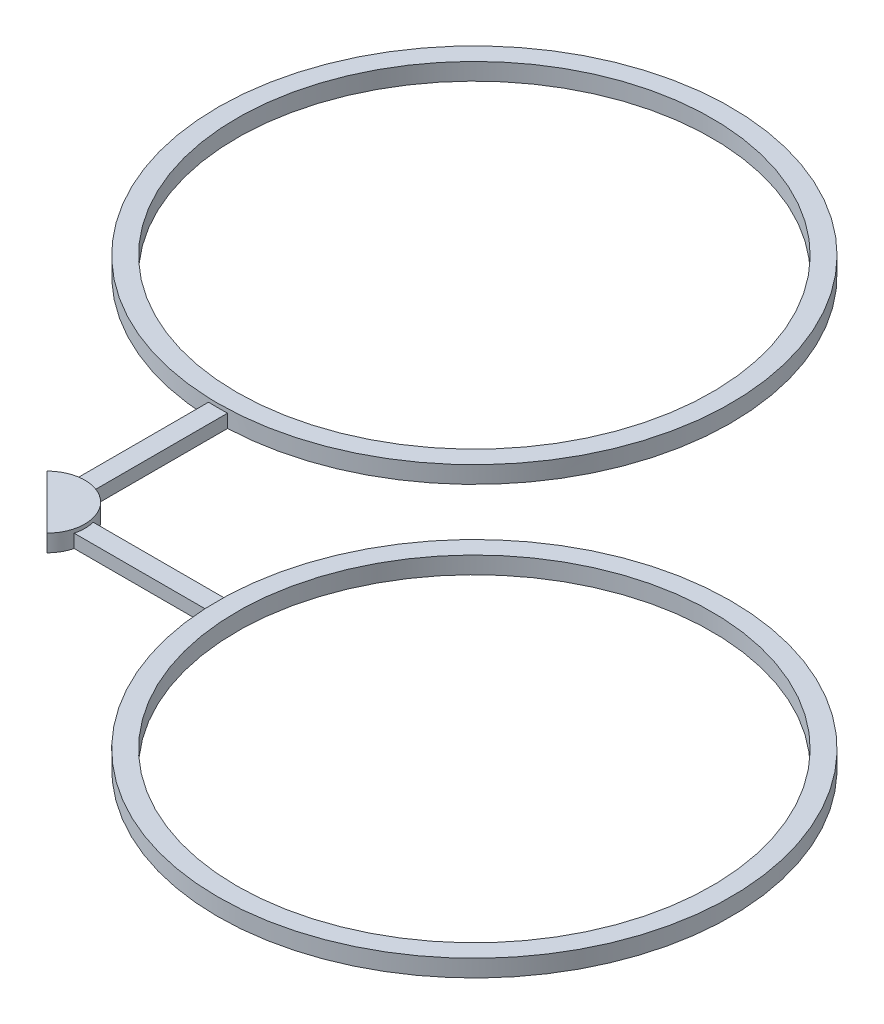
ISO-10303-21;
HEADER;
FILE_DESCRIPTION(('STEP AP214'),'2;1');
FILE_NAME('part.step','',(''),(''),'','','');
FILE_SCHEMA(('AUTOMOTIVE_DESIGN { 1 0 10303 214 1 1 1 1 }'));
ENDSEC;
DATA;
#1=APPLICATION_CONTEXT('core data for automotive mechanical design processes');
#2=APPLICATION_PROTOCOL_DEFINITION('international standard','automotive_design',2000,#1);
#3=PRODUCT_CONTEXT('',#1,'mechanical');
#4=PRODUCT('Part','Part','',(#3));
#5=PRODUCT_RELATED_PRODUCT_CATEGORY('part','',(#4));
#6=PRODUCT_DEFINITION_FORMATION('','',#4);
#7=PRODUCT_DEFINITION_CONTEXT('part definition',#1,'design');
#8=PRODUCT_DEFINITION('design','',#6,#7);
#9=PRODUCT_DEFINITION_SHAPE('','',#8);
#10=(LENGTH_UNIT() NAMED_UNIT(*) SI_UNIT(.MILLI.,.METRE.));
#11=(NAMED_UNIT(*) PLANE_ANGLE_UNIT() SI_UNIT($,.RADIAN.));
#12=(NAMED_UNIT(*) SI_UNIT($,.STERADIAN.) SOLID_ANGLE_UNIT());
#13=UNCERTAINTY_MEASURE_WITH_UNIT(LENGTH_MEASURE(1.E-05),#10,'distance_accuracy_value','');
#14=(GEOMETRIC_REPRESENTATION_CONTEXT(3) GLOBAL_UNCERTAINTY_ASSIGNED_CONTEXT((#13)) GLOBAL_UNIT_ASSIGNED_CONTEXT((#10,
#11,#12)) REPRESENTATION_CONTEXT('',''));
#15=CARTESIAN_POINT('',(0.,0.,0.));
#16=DIRECTION('',(0.,0.,1.));
#17=DIRECTION('',(1.,0.,0.));
#18=AXIS2_PLACEMENT_3D('',#15,#16,#17);
#19=CARTESIAN_POINT('',(0.,1.8,0.));
#20=DIRECTION('',(0.,-1.,0.));
#21=DIRECTION('',(0.,0.,-1.));
#22=AXIS2_PLACEMENT_3D('',#19,#20,#21);
#23=CYLINDRICAL_SURFACE('',#22,4.);
#24=CARTESIAN_POINT('',(0.,1.4,0.));
#25=DIRECTION('',(0.,1.,0.));
#26=DIRECTION('',(0.,0.,1.));
#27=AXIS2_PLACEMENT_3D('',#24,#25,#26);
#28=CIRCLE('',#27,4.);
#29=CARTESIAN_POINT('',(3.87298334620742,1.4,0.999999999999988));
#30=VERTEX_POINT('',#29);
#31=CARTESIAN_POINT('',(3.87298334620741,1.4,-1.00000000000001));
#32=VERTEX_POINT('',#31);
#33=EDGE_CURVE('E128',#30,#32,#28,.T.);
#34=ORIENTED_EDGE('',*,*,#33,.T.);
#35=DIRECTION('',(0.,-1.,0.));
#36=VECTOR('',#35,1.);
#37=CARTESIAN_POINT('',(3.87298334620741,1.4,-1.00000000000001));
#38=LINE('',#37,#36);
#39=CARTESIAN_POINT('',(3.87298334620741,0.,-1.00000000000001));
#40=VERTEX_POINT('',#39);
#41=EDGE_CURVE('E162',#32,#40,#38,.T.);
#42=ORIENTED_EDGE('',*,*,#41,.T.);
#43=CARTESIAN_POINT('',(0.,0.,0.));
#44=DIRECTION('',(0.,1.,0.));
#45=DIRECTION('',(0.,0.,1.));
#46=AXIS2_PLACEMENT_3D('',#43,#44,#45);
#47=CIRCLE('',#46,4.);
#48=CARTESIAN_POINT('',(0.999999999999999,0.,-3.87298334620742));
#49=VERTEX_POINT('',#48);
#50=EDGE_CURVE('E230',#49,#40,#47,.F.);
#51=ORIENTED_EDGE('',*,*,#50,.F.);
#52=DIRECTION('',(0.,-1.,0.));
#53=VECTOR('',#52,1.);
#54=CARTESIAN_POINT('',(0.999999999999999,1.4,-3.87298334620742));
#55=LINE('',#54,#53);
#56=CARTESIAN_POINT('',(0.999999999999999,1.4,-3.87298334620742));
#57=VERTEX_POINT('',#56);
#58=EDGE_CURVE('E210',#57,#49,#55,.T.);
#59=ORIENTED_EDGE('',*,*,#58,.F.);
#60=CARTESIAN_POINT('',(0.,1.4,0.));
#61=DIRECTION('',(0.,1.,0.));
#62=DIRECTION('',(0.,0.,1.));
#63=AXIS2_PLACEMENT_3D('',#60,#61,#62);
#64=CIRCLE('',#63,4.);
#65=CARTESIAN_POINT('',(-1.,1.4,-3.87298334620742));
#66=VERTEX_POINT('',#65);
#67=EDGE_CURVE('E188',#66,#57,#64,.F.);
#68=ORIENTED_EDGE('',*,*,#67,.F.);
#69=DIRECTION('',(0.,-1.,0.));
#70=VECTOR('',#69,1.);
#71=CARTESIAN_POINT('',(-1.,1.4,-3.87298334620742));
#72=LINE('',#71,#70);
#73=CARTESIAN_POINT('',(-1.,0.,-3.87298334620742));
#74=VERTEX_POINT('',#73);
#75=EDGE_CURVE('E213',#66,#74,#72,.T.);
#76=ORIENTED_EDGE('',*,*,#75,.T.);
#77=CARTESIAN_POINT('',(-2.8284271247462,0.,-2.82842712474619));
#78=VERTEX_POINT('',#77);
#79=EDGE_CURVE('E226',#78,#74,#47,.F.);
#80=ORIENTED_EDGE('',*,*,#79,.F.);
#81=DIRECTION('',(0.,-1.,0.));
#82=VECTOR('',#81,1.);
#83=CARTESIAN_POINT('',(-2.8284271247462,1.8,-2.82842712474619));
#84=LINE('',#83,#82);
#85=CARTESIAN_POINT('',(-2.8284271247462,1.8,-2.82842712474619));
#86=VERTEX_POINT('',#85);
#87=EDGE_CURVE('E12',#86,#78,#84,.T.);
#88=ORIENTED_EDGE('',*,*,#87,.F.);
#89=CARTESIAN_POINT('',(0.,1.8,0.));
#90=DIRECTION('',(0.,1.,0.));
#91=DIRECTION('',(0.,0.,1.));
#92=AXIS2_PLACEMENT_3D('',#89,#90,#91);
#93=CIRCLE('',#92,4.);
#94=CARTESIAN_POINT('',(2.8284271247462,1.8,2.82842712474619));
#95=VERTEX_POINT('',#94);
#96=EDGE_CURVE('E218',#86,#95,#93,.F.);
#97=ORIENTED_EDGE('',*,*,#96,.T.);
#98=DIRECTION('',(0.,-1.,0.));
#99=VECTOR('',#98,1.);
#100=CARTESIAN_POINT('',(2.8284271247462,1.8,2.82842712474619));
#101=LINE('',#100,#99);
#102=CARTESIAN_POINT('',(2.8284271247462,0.,2.82842712474619));
#103=VERTEX_POINT('',#102);
#104=EDGE_CURVE('E53',#95,#103,#101,.T.);
#105=ORIENTED_EDGE('',*,*,#104,.T.);
#106=CARTESIAN_POINT('',(3.87298334620742,0.,0.999999999999988));
#107=VERTEX_POINT('',#106);
#108=EDGE_CURVE('E217',#107,#103,#47,.F.);
#109=ORIENTED_EDGE('',*,*,#108,.F.);
#110=DIRECTION('',(0.,-1.,0.));
#111=VECTOR('',#110,1.);
#112=CARTESIAN_POINT('',(3.87298334620742,1.4,0.999999999999988));
#113=LINE('',#112,#111);
#114=EDGE_CURVE('E139',#30,#107,#113,.T.);
#115=ORIENTED_EDGE('',*,*,#114,.F.);
#116=EDGE_LOOP('',(#34,#42,#51,#59,#68,#76,#80,#88,#97,#105,#109,#115));
#117=FACE_BOUND('',#116,.T.);
#118=ADVANCED_FACE('F45',(#117),#23,.T.);
#119=CARTESIAN_POINT('',(0.,1.8,0.));
#120=DIRECTION('',(0.707106781186546,0.,-0.707106781186549));
#121=DIRECTION('',(-0.707106781186549,0.,-0.707106781186546));
#122=AXIS2_PLACEMENT_3D('',#119,#120,#121);
#123=PLANE('',#122);
#124=DIRECTION('',(0.707106781186549,0.,0.707106781186546));
#125=VECTOR('',#124,1.);
#126=CARTESIAN_POINT('',(0.,0.,0.));
#127=LINE('',#126,#125);
#128=EDGE_CURVE('E223',#78,#103,#127,.T.);
#129=ORIENTED_EDGE('',*,*,#128,.T.);
#130=ORIENTED_EDGE('',*,*,#104,.F.);
#131=DIRECTION('',(0.707106781186549,0.,0.707106781186546));
#132=VECTOR('',#131,1.);
#133=CARTESIAN_POINT('',(0.,1.8,0.));
#134=LINE('',#133,#132);
#135=EDGE_CURVE('E222',#86,#95,#134,.T.);
#136=ORIENTED_EDGE('',*,*,#135,.F.);
#137=ORIENTED_EDGE('',*,*,#87,.T.);
#138=EDGE_LOOP('',(#129,#130,#136,#137));
#139=FACE_BOUND('',#138,.T.);
#140=ADVANCED_FACE('F242',(#139),#123,.F.);
#141=CARTESIAN_POINT('',(0.,1.8,0.));
#142=DIRECTION('',(0.,1.,0.));
#143=DIRECTION('',(0.,0.,1.));
#144=AXIS2_PLACEMENT_3D('',#141,#142,#143);
#145=PLANE('',#144);
#146=ORIENTED_EDGE('',*,*,#96,.F.);
#147=ORIENTED_EDGE('',*,*,#135,.T.);
#148=EDGE_LOOP('',(#146,#147));
#149=FACE_BOUND('',#148,.T.);
#150=ADVANCED_FACE('F296',(#149),#145,.T.);
#151=CARTESIAN_POINT('',(0.,0.,0.));
#152=DIRECTION('',(0.,1.,0.));
#153=DIRECTION('',(0.,0.,1.));
#154=AXIS2_PLACEMENT_3D('',#151,#152,#153);
#155=PLANE('',#154);
#156=ORIENTED_EDGE('',*,*,#79,.T.);
#157=DIRECTION('',(0.,0.,1.));
#158=VECTOR('',#157,1.);
#159=CARTESIAN_POINT('',(-1.,0.,0.));
#160=LINE('',#159,#158);
#161=CARTESIAN_POINT('',(-1.,0.,-18.0185248735359));
#162=VERTEX_POINT('',#161);
#163=EDGE_CURVE('E178',#162,#74,#160,.T.);
#164=ORIENTED_EDGE('',*,*,#163,.F.);
#165=CARTESIAN_POINT('',(0.,0.,-45.));
#166=DIRECTION('',(0.,1.,0.));
#167=DIRECTION('',(0.,0.,1.));
#168=AXIS2_PLACEMENT_3D('',#165,#166,#167);
#169=CIRCLE('',#168,27.);
#170=CARTESIAN_POINT('',(0.999999999999996,0.,-18.0185248735359));
#171=VERTEX_POINT('',#170);
#172=EDGE_CURVE('E174',#171,#162,#169,.T.);
#173=ORIENTED_EDGE('',*,*,#172,.F.);
#174=DIRECTION('',(0.,0.,1.));
#175=VECTOR('',#174,1.);
#176=CARTESIAN_POINT('',(1.,0.,0.));
#177=LINE('',#176,#175);
#178=EDGE_CURVE('E67',#171,#49,#177,.T.);
#179=ORIENTED_EDGE('',*,*,#178,.T.);
#180=ORIENTED_EDGE('',*,*,#50,.T.);
#181=DIRECTION('',(-1.,0.,0.));
#182=VECTOR('',#181,1.);
#183=CARTESIAN_POINT('',(0.,0.,-1.));
#184=LINE('',#183,#182);
#185=CARTESIAN_POINT('',(18.0185248735359,0.,-1.00000000000006));
#186=VERTEX_POINT('',#185);
#187=EDGE_CURVE('E149',#186,#40,#184,.T.);
#188=ORIENTED_EDGE('',*,*,#187,.F.);
#189=CARTESIAN_POINT('',(45.,0.,-1.59594559789866E-13));
#190=DIRECTION('',(0.,1.,0.));
#191=DIRECTION('',(0.,0.,1.));
#192=AXIS2_PLACEMENT_3D('',#189,#190,#191);
#193=CIRCLE('',#192,27.);
#194=CARTESIAN_POINT('',(18.0185248735359,0.,0.999999999999938));
#195=VERTEX_POINT('',#194);
#196=EDGE_CURVE('E152',#186,#195,#193,.F.);
#197=ORIENTED_EDGE('',*,*,#196,.T.);
#198=DIRECTION('',(-1.,0.,0.));
#199=VECTOR('',#198,1.);
#200=CARTESIAN_POINT('',(0.,0.,1.));
#201=LINE('',#200,#199);
#202=EDGE_CURVE('E60',#195,#107,#201,.T.);
#203=ORIENTED_EDGE('',*,*,#202,.T.);
#204=ORIENTED_EDGE('',*,*,#108,.T.);
#205=ORIENTED_EDGE('',*,*,#128,.F.);
#206=EDGE_LOOP('',(#156,#164,#173,#179,#180,#188,#197,#203,#204,#205));
#207=FACE_BOUND('',#206,.T.);
#208=CARTESIAN_POINT('',(0.,0.,-45.));
#209=DIRECTION('',(0.,1.,0.));
#210=DIRECTION('',(0.,0.,1.));
#211=AXIS2_PLACEMENT_3D('',#208,#209,#210);
#212=CIRCLE('',#211,25.);
#213=CARTESIAN_POINT('',(0.,0.,-20.));
#214=VERTEX_POINT('',#213);
#215=EDGE_CURVE('E168',#214,#214,#212,.T.);
#216=ORIENTED_EDGE('',*,*,#215,.T.);
#217=EDGE_LOOP('',(#216));
#218=FACE_BOUND('',#217,.T.);
#219=CARTESIAN_POINT('',(45.,0.,-1.59594559789866E-13));
#220=DIRECTION('',(0.,1.,0.));
#221=DIRECTION('',(0.,0.,1.));
#222=AXIS2_PLACEMENT_3D('',#219,#220,#221);
#223=CIRCLE('',#222,25.);
#224=CARTESIAN_POINT('',(45.,0.,24.9999999999998));
#225=VERTEX_POINT('',#224);
#226=EDGE_CURVE('E267',#225,#225,#223,.F.);
#227=ORIENTED_EDGE('',*,*,#226,.F.);
#228=EDGE_LOOP('',(#227));
#229=FACE_BOUND('',#228,.T.);
#230=ADVANCED_FACE('F244',(#207,#218,#229),#155,.F.);
#231=CARTESIAN_POINT('',(-1.,1.4,0.));
#232=DIRECTION('',(1.,0.,0.));
#233=DIRECTION('',(0.,0.,-1.));
#234=AXIS2_PLACEMENT_3D('',#231,#232,#233);
#235=PLANE('',#234);
#236=ORIENTED_EDGE('',*,*,#163,.T.);
#237=ORIENTED_EDGE('',*,*,#75,.F.);
#238=DIRECTION('',(0.,0.,1.));
#239=VECTOR('',#238,1.);
#240=CARTESIAN_POINT('',(-1.,1.4,0.));
#241=LINE('',#240,#239);
#242=CARTESIAN_POINT('',(-1.,1.4,-18.0185248735359));
#243=VERTEX_POINT('',#242);
#244=EDGE_CURVE('E185',#243,#66,#241,.T.);
#245=ORIENTED_EDGE('',*,*,#244,.F.);
#246=DIRECTION('',(0.,-1.,0.));
#247=VECTOR('',#246,1.);
#248=CARTESIAN_POINT('',(-1.,1.4,-18.0185248735359));
#249=LINE('',#248,#247);
#250=EDGE_CURVE('E199',#243,#162,#249,.T.);
#251=ORIENTED_EDGE('',*,*,#250,.T.);
#252=EDGE_LOOP('',(#236,#237,#245,#251));
#253=FACE_BOUND('',#252,.T.);
#254=ADVANCED_FACE('F251',(#253),#235,.F.);
#255=CARTESIAN_POINT('',(1.,1.4,0.));
#256=DIRECTION('',(1.,0.,0.));
#257=DIRECTION('',(0.,0.,-1.));
#258=AXIS2_PLACEMENT_3D('',#255,#256,#257);
#259=PLANE('',#258);
#260=ORIENTED_EDGE('',*,*,#178,.F.);
#261=DIRECTION('',(0.,-1.,0.));
#262=VECTOR('',#261,1.);
#263=CARTESIAN_POINT('',(0.999999999999996,1.4,-18.0185248735359));
#264=LINE('',#263,#262);
#265=CARTESIAN_POINT('',(0.999999999999996,1.4,-18.0185248735359));
#266=VERTEX_POINT('',#265);
#267=EDGE_CURVE('E206',#266,#171,#264,.T.);
#268=ORIENTED_EDGE('',*,*,#267,.F.);
#269=DIRECTION('',(0.,0.,1.));
#270=VECTOR('',#269,1.);
#271=CARTESIAN_POINT('',(1.,1.4,0.));
#272=LINE('',#271,#270);
#273=EDGE_CURVE('E191',#266,#57,#272,.T.);
#274=ORIENTED_EDGE('',*,*,#273,.T.);
#275=ORIENTED_EDGE('',*,*,#58,.T.);
#276=EDGE_LOOP('',(#260,#268,#274,#275));
#277=FACE_BOUND('',#276,.T.);
#278=ADVANCED_FACE('F258',(#277),#259,.T.);
#279=CARTESIAN_POINT('',(0.,1.4,0.));
#280=DIRECTION('',(0.,1.,0.));
#281=DIRECTION('',(0.,0.,1.));
#282=AXIS2_PLACEMENT_3D('',#279,#280,#281);
#283=PLANE('',#282);
#284=ORIENTED_EDGE('',*,*,#244,.T.);
#285=ORIENTED_EDGE('',*,*,#67,.T.);
#286=ORIENTED_EDGE('',*,*,#273,.F.);
#287=CARTESIAN_POINT('',(0.,1.4,-45.));
#288=DIRECTION('',(0.,1.,0.));
#289=DIRECTION('',(0.,0.,1.));
#290=AXIS2_PLACEMENT_3D('',#287,#288,#289);
#291=CIRCLE('',#290,27.);
#292=EDGE_CURVE('E195',#243,#266,#291,.T.);
#293=ORIENTED_EDGE('',*,*,#292,.F.);
#294=EDGE_LOOP('',(#284,#285,#286,#293));
#295=FACE_BOUND('',#294,.T.);
#296=ADVANCED_FACE('F309',(#295),#283,.T.);
#297=CARTESIAN_POINT('',(0.,1.8,-45.));
#298=DIRECTION('',(0.,-1.,0.));
#299=DIRECTION('',(0.,0.,-1.));
#300=AXIS2_PLACEMENT_3D('',#297,#298,#299);
#301=CYLINDRICAL_SURFACE('',#300,27.);
#302=CARTESIAN_POINT('',(0.,1.8,-45.));
#303=DIRECTION('',(0.,1.,0.));
#304=DIRECTION('',(0.,0.,1.));
#305=AXIS2_PLACEMENT_3D('',#302,#303,#304);
#306=CIRCLE('',#305,27.);
#307=CARTESIAN_POINT('',(0.,1.8,-18.));
#308=VERTEX_POINT('',#307);
#309=EDGE_CURVE('E173',#308,#308,#306,.T.);
#310=ORIENTED_EDGE('',*,*,#309,.F.);
#311=EDGE_LOOP('',(#310));
#312=FACE_BOUND('',#311,.T.);
#313=ORIENTED_EDGE('',*,*,#172,.T.);
#314=ORIENTED_EDGE('',*,*,#250,.F.);
#315=ORIENTED_EDGE('',*,*,#292,.T.);
#316=ORIENTED_EDGE('',*,*,#267,.T.);
#317=EDGE_LOOP('',(#313,#314,#315,#316));
#318=FACE_BOUND('',#317,.T.);
#319=ADVANCED_FACE('F255',(#312,#318),#301,.T.);
#320=CARTESIAN_POINT('',(0.,1.8,-45.));
#321=DIRECTION('',(0.,-1.,0.));
#322=DIRECTION('',(0.,0.,-1.));
#323=AXIS2_PLACEMENT_3D('',#320,#321,#322);
#324=CYLINDRICAL_SURFACE('',#323,25.);
#325=CARTESIAN_POINT('',(0.,1.8,-45.));
#326=DIRECTION('',(0.,1.,0.));
#327=DIRECTION('',(0.,0.,1.));
#328=AXIS2_PLACEMENT_3D('',#325,#326,#327);
#329=CIRCLE('',#328,25.);
#330=CARTESIAN_POINT('',(0.,1.8,-20.));
#331=VERTEX_POINT('',#330);
#332=EDGE_CURVE('E169',#331,#331,#329,.T.);
#333=ORIENTED_EDGE('',*,*,#332,.T.);
#334=EDGE_LOOP('',(#333));
#335=FACE_BOUND('',#334,.T.);
#336=ORIENTED_EDGE('',*,*,#215,.F.);
#337=EDGE_LOOP('',(#336));
#338=FACE_BOUND('',#337,.T.);
#339=ADVANCED_FACE('F313',(#335,#338),#324,.F.);
#340=CARTESIAN_POINT('',(0.,1.8,0.));
#341=DIRECTION('',(0.,1.,0.));
#342=DIRECTION('',(0.,0.,1.));
#343=AXIS2_PLACEMENT_3D('',#340,#341,#342);
#344=PLANE('',#343);
#345=ORIENTED_EDGE('',*,*,#332,.F.);
#346=EDGE_LOOP('',(#345));
#347=FACE_BOUND('',#346,.T.);
#348=ORIENTED_EDGE('',*,*,#309,.T.);
#349=EDGE_LOOP('',(#348));
#350=FACE_BOUND('',#349,.T.);
#351=ADVANCED_FACE('F316',(#347,#350),#344,.T.);
#352=CARTESIAN_POINT('',(0.,1.4,-1.));
#353=DIRECTION('',(0.,0.,1.));
#354=DIRECTION('',(1.,0.,0.));
#355=AXIS2_PLACEMENT_3D('',#352,#353,#354);
#356=PLANE('',#355);
#357=ORIENTED_EDGE('',*,*,#187,.T.);
#358=ORIENTED_EDGE('',*,*,#41,.F.);
#359=DIRECTION('',(-1.,0.,0.));
#360=VECTOR('',#359,1.);
#361=CARTESIAN_POINT('',(0.,1.4,-1.));
#362=LINE('',#361,#360);
#363=CARTESIAN_POINT('',(18.0185248735359,1.4,-1.00000000000006));
#364=VERTEX_POINT('',#363);
#365=EDGE_CURVE('E144',#364,#32,#362,.T.);
#366=ORIENTED_EDGE('',*,*,#365,.F.);
#367=DIRECTION('',(0.,-1.,0.));
#368=VECTOR('',#367,1.);
#369=CARTESIAN_POINT('',(18.0185248735359,1.4,-1.00000000000006));
#370=LINE('',#369,#368);
#371=EDGE_CURVE('E142',#364,#186,#370,.T.);
#372=ORIENTED_EDGE('',*,*,#371,.T.);
#373=EDGE_LOOP('',(#357,#358,#366,#372));
#374=FACE_BOUND('',#373,.T.);
#375=ADVANCED_FACE('F323',(#374),#356,.F.);
#376=CARTESIAN_POINT('',(0.,1.4,1.));
#377=DIRECTION('',(0.,0.,1.));
#378=DIRECTION('',(1.,0.,0.));
#379=AXIS2_PLACEMENT_3D('',#376,#377,#378);
#380=PLANE('',#379);
#381=ORIENTED_EDGE('',*,*,#202,.F.);
#382=DIRECTION('',(0.,-1.,0.));
#383=VECTOR('',#382,1.);
#384=CARTESIAN_POINT('',(18.0185248735359,1.4,0.999999999999938));
#385=LINE('',#384,#383);
#386=CARTESIAN_POINT('',(18.0185248735359,1.4,0.999999999999938));
#387=VERTEX_POINT('',#386);
#388=EDGE_CURVE('E132',#387,#195,#385,.T.);
#389=ORIENTED_EDGE('',*,*,#388,.F.);
#390=DIRECTION('',(-1.,0.,0.));
#391=VECTOR('',#390,1.);
#392=CARTESIAN_POINT('',(0.,1.4,1.));
#393=LINE('',#392,#391);
#394=EDGE_CURVE('E121',#387,#30,#393,.T.);
#395=ORIENTED_EDGE('',*,*,#394,.T.);
#396=ORIENTED_EDGE('',*,*,#114,.T.);
#397=EDGE_LOOP('',(#381,#389,#395,#396));
#398=FACE_BOUND('',#397,.T.);
#399=ADVANCED_FACE('F135',(#398),#380,.T.);
#400=CARTESIAN_POINT('',(0.,1.4,0.));
#401=DIRECTION('',(0.,1.,0.));
#402=DIRECTION('',(0.,0.,1.));
#403=AXIS2_PLACEMENT_3D('',#400,#401,#402);
#404=PLANE('',#403);
#405=CARTESIAN_POINT('',(45.,1.4,-1.59594559789866E-13));
#406=DIRECTION('',(0.,1.,0.));
#407=DIRECTION('',(0.,0.,1.));
#408=AXIS2_PLACEMENT_3D('',#405,#406,#407);
#409=CIRCLE('',#408,27.);
#410=EDGE_CURVE('E125',#364,#387,#409,.T.);
#411=ORIENTED_EDGE('',*,*,#410,.F.);
#412=ORIENTED_EDGE('',*,*,#365,.T.);
#413=ORIENTED_EDGE('',*,*,#33,.F.);
#414=ORIENTED_EDGE('',*,*,#394,.F.);
#415=EDGE_LOOP('',(#411,#412,#413,#414));
#416=FACE_BOUND('',#415,.T.);
#417=ADVANCED_FACE('F123',(#416),#404,.T.);
#418=CARTESIAN_POINT('',(45.,1.8,-1.59594559789866E-13));
#419=DIRECTION('',(0.,-1.,0.));
#420=DIRECTION('',(0.,0.,-1.));
#421=AXIS2_PLACEMENT_3D('',#418,#419,#420);
#422=CYLINDRICAL_SURFACE('',#421,27.);
#423=CARTESIAN_POINT('',(45.,1.8,-1.59594559789866E-13));
#424=DIRECTION('',(0.,1.,0.));
#425=DIRECTION('',(0.,0.,1.));
#426=AXIS2_PLACEMENT_3D('',#423,#424,#425);
#427=CIRCLE('',#426,27.);
#428=CARTESIAN_POINT('',(45.,1.8,26.9999999999998));
#429=VERTEX_POINT('',#428);
#430=EDGE_CURVE('E158',#429,#429,#427,.F.);
#431=ORIENTED_EDGE('',*,*,#430,.T.);
#432=EDGE_LOOP('',(#431));
#433=FACE_BOUND('',#432,.T.);
#434=ORIENTED_EDGE('',*,*,#371,.F.);
#435=ORIENTED_EDGE('',*,*,#410,.T.);
#436=ORIENTED_EDGE('',*,*,#388,.T.);
#437=ORIENTED_EDGE('',*,*,#196,.F.);
#438=EDGE_LOOP('',(#434,#435,#436,#437));
#439=FACE_BOUND('',#438,.T.);
#440=ADVANCED_FACE('F141',(#433,#439),#422,.T.);
#441=CARTESIAN_POINT('',(45.,1.8,-1.59594559789866E-13));
#442=DIRECTION('',(0.,-1.,0.));
#443=DIRECTION('',(0.,0.,-1.));
#444=AXIS2_PLACEMENT_3D('',#441,#442,#443);
#445=CYLINDRICAL_SURFACE('',#444,25.);
#446=CARTESIAN_POINT('',(45.,1.8,-1.59594559789866E-13));
#447=DIRECTION('',(0.,1.,0.));
#448=DIRECTION('',(0.,0.,1.));
#449=AXIS2_PLACEMENT_3D('',#446,#447,#448);
#450=CIRCLE('',#449,25.);
#451=CARTESIAN_POINT('',(45.,1.8,24.9999999999998));
#452=VERTEX_POINT('',#451);
#453=EDGE_CURVE('E266',#452,#452,#450,.F.);
#454=ORIENTED_EDGE('',*,*,#453,.F.);
#455=EDGE_LOOP('',(#454));
#456=FACE_BOUND('',#455,.T.);
#457=ORIENTED_EDGE('',*,*,#226,.T.);
#458=EDGE_LOOP('',(#457));
#459=FACE_BOUND('',#458,.T.);
#460=ADVANCED_FACE('F283',(#456,#459),#445,.F.);
#461=CARTESIAN_POINT('',(0.,1.8,0.));
#462=DIRECTION('',(0.,1.,0.));
#463=DIRECTION('',(0.,0.,1.));
#464=AXIS2_PLACEMENT_3D('',#461,#462,#463);
#465=PLANE('',#464);
#466=ORIENTED_EDGE('',*,*,#453,.T.);
#467=EDGE_LOOP('',(#466));
#468=FACE_BOUND('',#467,.T.);
#469=ORIENTED_EDGE('',*,*,#430,.F.);
#470=EDGE_LOOP('',(#469));
#471=FACE_BOUND('',#470,.T.);
#472=ADVANCED_FACE('F281',(#468,#471),#465,.T.);
#473=CLOSED_SHELL('',(#118,#140,#150,#230,#254,#278,#296,#319,#339,#351,#375,#399,#417,#440,
#460,#472));
#474=MANIFOLD_SOLID_BREP('B2',#473);
#475=ADVANCED_BREP_SHAPE_REPRESENTATION('',(#18,#474),#14);
#476=SHAPE_DEFINITION_REPRESENTATION(#9,#475);
ENDSEC;
END-ISO-10303-21;
